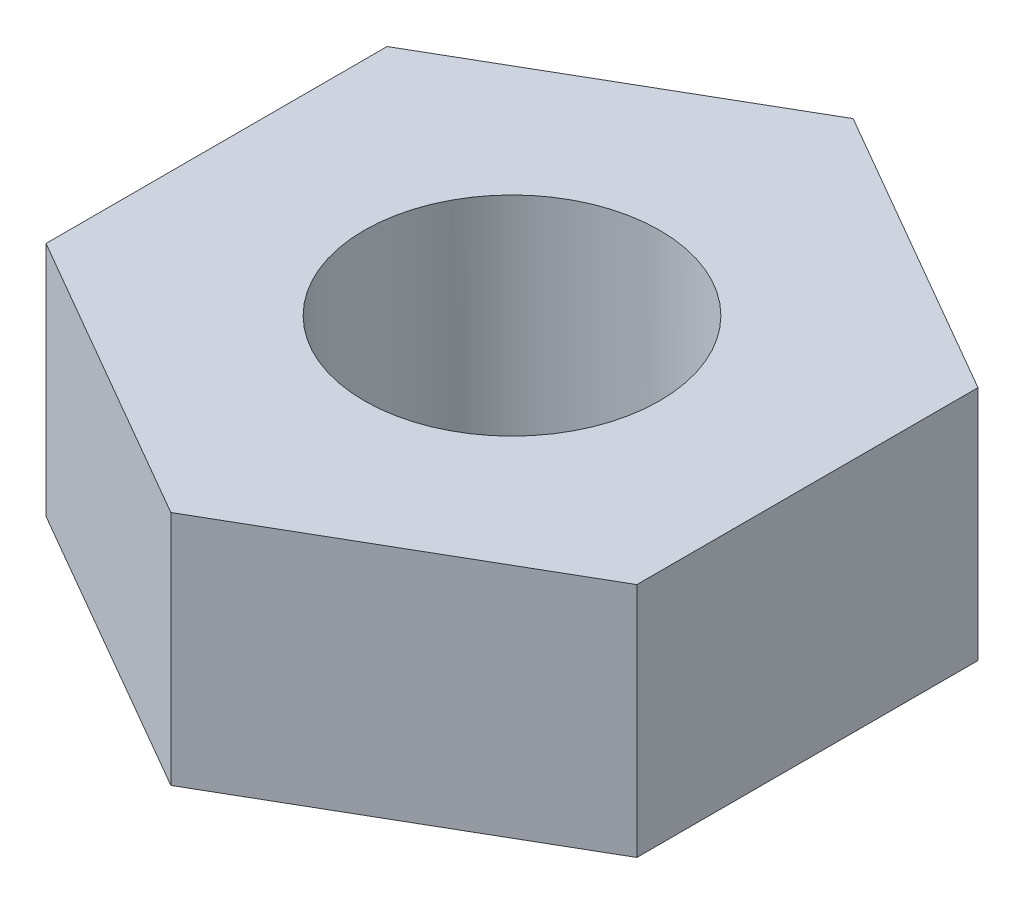
ISO-10303-21;
HEADER;
FILE_DESCRIPTION(('STEP AP214'),'2;1');
FILE_NAME('part.step','',(''),(''),'','','');
FILE_SCHEMA(('AUTOMOTIVE_DESIGN { 1 0 10303 214 1 1 1 1 }'));
ENDSEC;
DATA;
#1=APPLICATION_CONTEXT('core data for automotive mechanical design processes');
#2=APPLICATION_PROTOCOL_DEFINITION('international standard','automotive_design',2000,#1);
#3=PRODUCT_CONTEXT('',#1,'mechanical');
#4=PRODUCT('Part','Part','',(#3));
#5=PRODUCT_RELATED_PRODUCT_CATEGORY('part','',(#4));
#6=PRODUCT_DEFINITION_FORMATION('','',#4);
#7=PRODUCT_DEFINITION_CONTEXT('part definition',#1,'design');
#8=PRODUCT_DEFINITION('design','',#6,#7);
#9=PRODUCT_DEFINITION_SHAPE('','',#8);
#10=(LENGTH_UNIT() NAMED_UNIT(*) SI_UNIT(.MILLI.,.METRE.));
#11=(NAMED_UNIT(*) PLANE_ANGLE_UNIT() SI_UNIT($,.RADIAN.));
#12=(NAMED_UNIT(*) SI_UNIT($,.STERADIAN.) SOLID_ANGLE_UNIT());
#13=UNCERTAINTY_MEASURE_WITH_UNIT(LENGTH_MEASURE(1.E-05),#10,'distance_accuracy_value','');
#14=(GEOMETRIC_REPRESENTATION_CONTEXT(3) GLOBAL_UNCERTAINTY_ASSIGNED_CONTEXT((#13)) GLOBAL_UNIT_ASSIGNED_CONTEXT((#10,
#11,#12)) REPRESENTATION_CONTEXT('',''));
#15=CARTESIAN_POINT('',(0.,0.,0.));
#16=DIRECTION('',(0.,0.,1.));
#17=DIRECTION('',(1.,0.,0.));
#18=AXIS2_PLACEMENT_3D('',#15,#16,#17);
#19=CARTESIAN_POINT('',(2.,-1.6,-1.15470053837925));
#20=DIRECTION('',(1.,0.,0.));
#21=DIRECTION('',(0.,0.,-1.));
#22=AXIS2_PLACEMENT_3D('',#19,#20,#21);
#23=PLANE('',#22);
#24=DIRECTION('',(0.,0.,-1.));
#25=VECTOR('',#24,1.);
#26=CARTESIAN_POINT('',(2.,0.,-1.15470053837925));
#27=LINE('',#26,#25);
#28=CARTESIAN_POINT('',(2.,0.,1.15470053837925));
#29=VERTEX_POINT('',#28);
#30=CARTESIAN_POINT('',(2.,0.,-1.15470053837925));
#31=VERTEX_POINT('',#30);
#32=EDGE_CURVE('E127',#29,#31,#27,.T.);
#33=ORIENTED_EDGE('',*,*,#32,.F.);
#34=DIRECTION('',(0.,1.,0.));
#35=VECTOR('',#34,1.);
#36=CARTESIAN_POINT('',(2.,-1.6,1.15470053837925));
#37=LINE('',#36,#35);
#38=CARTESIAN_POINT('',(2.,-1.6,1.15470053837925));
#39=VERTEX_POINT('',#38);
#40=EDGE_CURVE('E11',#39,#29,#37,.T.);
#41=ORIENTED_EDGE('',*,*,#40,.F.);
#42=DIRECTION('',(0.,0.,-1.));
#43=VECTOR('',#42,1.);
#44=CARTESIAN_POINT('',(2.,-1.6,-1.15470053837925));
#45=LINE('',#44,#43);
#46=CARTESIAN_POINT('',(2.,-1.6,-1.15470053837925));
#47=VERTEX_POINT('',#46);
#48=EDGE_CURVE('E141',#39,#47,#45,.T.);
#49=ORIENTED_EDGE('',*,*,#48,.T.);
#50=DIRECTION('',(0.,1.,0.));
#51=VECTOR('',#50,1.);
#52=CARTESIAN_POINT('',(2.,-1.6,-1.15470053837925));
#53=LINE('',#52,#51);
#54=EDGE_CURVE('E91',#47,#31,#53,.T.);
#55=ORIENTED_EDGE('',*,*,#54,.T.);
#56=EDGE_LOOP('',(#33,#41,#49,#55));
#57=FACE_BOUND('',#56,.T.);
#58=ADVANCED_FACE('F41',(#57),#23,.T.);
#59=CARTESIAN_POINT('',(2.,-1.6,1.15470053837925));
#60=DIRECTION('',(0.5,0.,0.866025403784439));
#61=DIRECTION('',(0.866025403784439,0.,-0.5));
#62=AXIS2_PLACEMENT_3D('',#59,#60,#61);
#63=PLANE('',#62);
#64=DIRECTION('',(0.866025403784439,0.,-0.5));
#65=VECTOR('',#64,1.);
#66=CARTESIAN_POINT('',(2.,0.,1.15470053837925));
#67=LINE('',#66,#65);
#68=CARTESIAN_POINT('',(0.,0.,2.3094010767585));
#69=VERTEX_POINT('',#68);
#70=EDGE_CURVE('E139',#69,#29,#67,.T.);
#71=ORIENTED_EDGE('',*,*,#70,.F.);
#72=DIRECTION('',(0.,1.,0.));
#73=VECTOR('',#72,1.);
#74=CARTESIAN_POINT('',(0.,-1.6,2.3094010767585));
#75=LINE('',#74,#73);
#76=CARTESIAN_POINT('',(0.,-1.6,2.3094010767585));
#77=VERTEX_POINT('',#76);
#78=EDGE_CURVE('E50',#77,#69,#75,.T.);
#79=ORIENTED_EDGE('',*,*,#78,.F.);
#80=DIRECTION('',(0.866025403784439,0.,-0.5));
#81=VECTOR('',#80,1.);
#82=CARTESIAN_POINT('',(2.,-1.6,1.15470053837925));
#83=LINE('',#82,#81);
#84=EDGE_CURVE('E117',#77,#39,#83,.T.);
#85=ORIENTED_EDGE('',*,*,#84,.T.);
#86=ORIENTED_EDGE('',*,*,#40,.T.);
#87=EDGE_LOOP('',(#71,#79,#85,#86));
#88=FACE_BOUND('',#87,.T.);
#89=ADVANCED_FACE('F150',(#88),#63,.T.);
#90=CARTESIAN_POINT('',(0.,-1.6,2.3094010767585));
#91=DIRECTION('',(-0.5,0.,0.866025403784439));
#92=DIRECTION('',(0.866025403784439,0.,0.5));
#93=AXIS2_PLACEMENT_3D('',#90,#91,#92);
#94=PLANE('',#93);
#95=DIRECTION('',(0.866025403784439,0.,0.5));
#96=VECTOR('',#95,1.);
#97=CARTESIAN_POINT('',(0.,0.,2.3094010767585));
#98=LINE('',#97,#96);
#99=CARTESIAN_POINT('',(-2.,0.,1.15470053837925));
#100=VERTEX_POINT('',#99);
#101=EDGE_CURVE('E104',#100,#69,#98,.T.);
#102=ORIENTED_EDGE('',*,*,#101,.F.);
#103=DIRECTION('',(0.,1.,0.));
#104=VECTOR('',#103,1.);
#105=CARTESIAN_POINT('',(-2.,-1.6,1.15470053837925));
#106=LINE('',#105,#104);
#107=CARTESIAN_POINT('',(-2.,-1.6,1.15470053837925));
#108=VERTEX_POINT('',#107);
#109=EDGE_CURVE('E99',#108,#100,#106,.T.);
#110=ORIENTED_EDGE('',*,*,#109,.F.);
#111=DIRECTION('',(0.866025403784439,0.,0.5));
#112=VECTOR('',#111,1.);
#113=CARTESIAN_POINT('',(0.,-1.6,2.3094010767585));
#114=LINE('',#113,#112);
#115=EDGE_CURVE('E102',#108,#77,#114,.T.);
#116=ORIENTED_EDGE('',*,*,#115,.T.);
#117=ORIENTED_EDGE('',*,*,#78,.T.);
#118=EDGE_LOOP('',(#102,#110,#116,#117));
#119=FACE_BOUND('',#118,.T.);
#120=ADVANCED_FACE('F101',(#119),#94,.T.);
#121=CARTESIAN_POINT('',(-2.,-1.6,1.15470053837925));
#122=DIRECTION('',(-1.,0.,0.));
#123=DIRECTION('',(0.,0.,1.));
#124=AXIS2_PLACEMENT_3D('',#121,#122,#123);
#125=PLANE('',#124);
#126=DIRECTION('',(0.,0.,1.));
#127=VECTOR('',#126,1.);
#128=CARTESIAN_POINT('',(-2.,0.,1.15470053837925));
#129=LINE('',#128,#127);
#130=CARTESIAN_POINT('',(-2.,0.,-1.15470053837925));
#131=VERTEX_POINT('',#130);
#132=EDGE_CURVE('E136',#131,#100,#129,.T.);
#133=ORIENTED_EDGE('',*,*,#132,.F.);
#134=DIRECTION('',(0.,1.,0.));
#135=VECTOR('',#134,1.);
#136=CARTESIAN_POINT('',(-2.,-1.6,-1.15470053837925));
#137=LINE('',#136,#135);
#138=CARTESIAN_POINT('',(-2.,-1.6,-1.15470053837925));
#139=VERTEX_POINT('',#138);
#140=EDGE_CURVE('E109',#139,#131,#137,.T.);
#141=ORIENTED_EDGE('',*,*,#140,.F.);
#142=DIRECTION('',(0.,0.,1.));
#143=VECTOR('',#142,1.);
#144=CARTESIAN_POINT('',(-2.,-1.6,1.15470053837925));
#145=LINE('',#144,#143);
#146=EDGE_CURVE('E115',#139,#108,#145,.T.);
#147=ORIENTED_EDGE('',*,*,#146,.T.);
#148=ORIENTED_EDGE('',*,*,#109,.T.);
#149=EDGE_LOOP('',(#133,#141,#147,#148));
#150=FACE_BOUND('',#149,.T.);
#151=ADVANCED_FACE('F119',(#150),#125,.T.);
#152=CARTESIAN_POINT('',(-2.,-1.6,-1.15470053837925));
#153=DIRECTION('',(-0.5,0.,-0.866025403784438));
#154=DIRECTION('',(-0.866025403784439,0.,0.5));
#155=AXIS2_PLACEMENT_3D('',#152,#153,#154);
#156=PLANE('',#155);
#157=DIRECTION('',(-0.866025403784439,0.,0.5));
#158=VECTOR('',#157,1.);
#159=CARTESIAN_POINT('',(-2.,0.,-1.15470053837925));
#160=LINE('',#159,#158);
#161=CARTESIAN_POINT('',(0.,0.,-2.3094010767585));
#162=VERTEX_POINT('',#161);
#163=EDGE_CURVE('E133',#162,#131,#160,.T.);
#164=ORIENTED_EDGE('',*,*,#163,.F.);
#165=DIRECTION('',(0.,1.,0.));
#166=VECTOR('',#165,1.);
#167=CARTESIAN_POINT('',(0.,-1.6,-2.3094010767585));
#168=LINE('',#167,#166);
#169=CARTESIAN_POINT('',(0.,-1.6,-2.3094010767585));
#170=VERTEX_POINT('',#169);
#171=EDGE_CURVE('E145',#170,#162,#168,.T.);
#172=ORIENTED_EDGE('',*,*,#171,.F.);
#173=DIRECTION('',(-0.866025403784439,0.,0.5));
#174=VECTOR('',#173,1.);
#175=CARTESIAN_POINT('',(-2.,-1.6,-1.15470053837925));
#176=LINE('',#175,#174);
#177=EDGE_CURVE('E120',#170,#139,#176,.T.);
#178=ORIENTED_EDGE('',*,*,#177,.T.);
#179=ORIENTED_EDGE('',*,*,#140,.T.);
#180=EDGE_LOOP('',(#164,#172,#178,#179));
#181=FACE_BOUND('',#180,.T.);
#182=ADVANCED_FACE('F163',(#181),#156,.T.);
#183=CARTESIAN_POINT('',(0.,-1.6,-2.3094010767585));
#184=DIRECTION('',(0.5,0.,-0.866025403784438));
#185=DIRECTION('',(-0.866025403784439,0.,-0.5));
#186=AXIS2_PLACEMENT_3D('',#183,#184,#185);
#187=PLANE('',#186);
#188=DIRECTION('',(-0.866025403784438,0.,-0.5));
#189=VECTOR('',#188,1.);
#190=CARTESIAN_POINT('',(0.,0.,-2.3094010767585));
#191=LINE('',#190,#189);
#192=EDGE_CURVE('E130',#31,#162,#191,.T.);
#193=ORIENTED_EDGE('',*,*,#192,.F.);
#194=ORIENTED_EDGE('',*,*,#54,.F.);
#195=DIRECTION('',(-0.866025403784438,0.,-0.5));
#196=VECTOR('',#195,1.);
#197=CARTESIAN_POINT('',(0.,-1.6,-2.3094010767585));
#198=LINE('',#197,#196);
#199=EDGE_CURVE('E122',#47,#170,#198,.T.);
#200=ORIENTED_EDGE('',*,*,#199,.T.);
#201=ORIENTED_EDGE('',*,*,#171,.T.);
#202=EDGE_LOOP('',(#193,#194,#200,#201));
#203=FACE_BOUND('',#202,.T.);
#204=ADVANCED_FACE('F146',(#203),#187,.T.);
#205=CARTESIAN_POINT('',(0.,-1.6,0.));
#206=DIRECTION('',(0.,-1.,0.));
#207=DIRECTION('',(0.,0.,-1.));
#208=AXIS2_PLACEMENT_3D('',#205,#206,#207);
#209=PLANE('',#208);
#210=CARTESIAN_POINT('',(0.,-1.6,0.));
#211=DIRECTION('',(0.,1.,0.));
#212=DIRECTION('',(0.,0.,1.));
#213=AXIS2_PLACEMENT_3D('',#210,#211,#212);
#214=CIRCLE('',#213,1.);
#215=CARTESIAN_POINT('',(0.,-1.6,1.));
#216=VERTEX_POINT('',#215);
#217=EDGE_CURVE('E185',#216,#216,#214,.T.);
#218=ORIENTED_EDGE('',*,*,#217,.T.);
#219=EDGE_LOOP('',(#218));
#220=FACE_BOUND('',#219,.T.);
#221=ORIENTED_EDGE('',*,*,#48,.F.);
#222=ORIENTED_EDGE('',*,*,#84,.F.);
#223=ORIENTED_EDGE('',*,*,#115,.F.);
#224=ORIENTED_EDGE('',*,*,#146,.F.);
#225=ORIENTED_EDGE('',*,*,#177,.F.);
#226=ORIENTED_EDGE('',*,*,#199,.F.);
#227=EDGE_LOOP('',(#221,#222,#223,#224,#225,#226));
#228=FACE_BOUND('',#227,.T.);
#229=ADVANCED_FACE('F113',(#220,#228),#209,.T.);
#230=CARTESIAN_POINT('',(0.,0.,0.));
#231=DIRECTION('',(0.,-1.,0.));
#232=DIRECTION('',(0.,0.,-1.));
#233=AXIS2_PLACEMENT_3D('',#230,#231,#232);
#234=PLANE('',#233);
#235=CARTESIAN_POINT('',(0.,0.,0.));
#236=DIRECTION('',(0.,-1.,0.));
#237=DIRECTION('',(0.,0.,-1.));
#238=AXIS2_PLACEMENT_3D('',#235,#236,#237);
#239=CIRCLE('',#238,1.);
#240=CARTESIAN_POINT('',(0.,0.,-1.));
#241=VERTEX_POINT('',#240);
#242=EDGE_CURVE('E44',#241,#241,#239,.T.);
#243=ORIENTED_EDGE('',*,*,#242,.T.);
#244=EDGE_LOOP('',(#243));
#245=FACE_BOUND('',#244,.T.);
#246=ORIENTED_EDGE('',*,*,#32,.T.);
#247=ORIENTED_EDGE('',*,*,#192,.T.);
#248=ORIENTED_EDGE('',*,*,#163,.T.);
#249=ORIENTED_EDGE('',*,*,#132,.T.);
#250=ORIENTED_EDGE('',*,*,#101,.T.);
#251=ORIENTED_EDGE('',*,*,#70,.T.);
#252=EDGE_LOOP('',(#246,#247,#248,#249,#250,#251));
#253=FACE_BOUND('',#252,.T.);
#254=ADVANCED_FACE('F149',(#245,#253),#234,.F.);
#255=CARTESIAN_POINT('',(0.,-1.6,0.));
#256=DIRECTION('',(0.,1.,0.));
#257=DIRECTION('',(0.,0.,1.));
#258=AXIS2_PLACEMENT_3D('',#255,#256,#257);
#259=CYLINDRICAL_SURFACE('',#258,1.);
#260=ORIENTED_EDGE('',*,*,#217,.F.);
#261=EDGE_LOOP('',(#260));
#262=FACE_BOUND('',#261,.T.);
#263=ORIENTED_EDGE('',*,*,#242,.F.);
#264=EDGE_LOOP('',(#263));
#265=FACE_BOUND('',#264,.T.);
#266=ADVANCED_FACE('F175',(#262,#265),#259,.F.);
#267=CLOSED_SHELL('',(#58,#89,#120,#151,#182,#204,#229,#254,#266));
#268=MANIFOLD_SOLID_BREP('B2',#267);
#269=ADVANCED_BREP_SHAPE_REPRESENTATION('',(#18,#268),#14);
#270=SHAPE_DEFINITION_REPRESENTATION(#9,#269);
ENDSEC;
END-ISO-10303-21;
